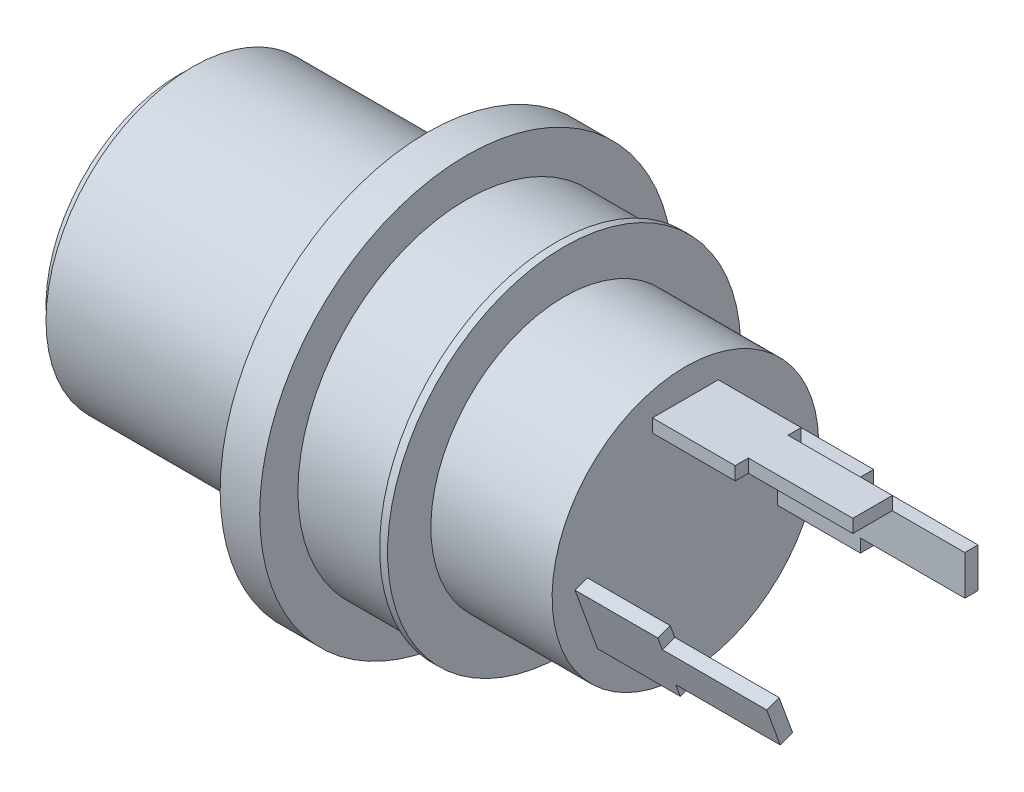
ISO-10303-21;
HEADER;
FILE_DESCRIPTION(('STEP AP214'),'2;1');
FILE_NAME('part.step','',(''),(''),'','','');
FILE_SCHEMA(('AUTOMOTIVE_DESIGN { 1 0 10303 214 1 1 1 1 }'));
ENDSEC;
DATA;
#1=APPLICATION_CONTEXT('core data for automotive mechanical design processes');
#2=APPLICATION_PROTOCOL_DEFINITION('international standard','automotive_design',2000,#1);
#3=PRODUCT_CONTEXT('',#1,'mechanical');
#4=PRODUCT('Part','Part','',(#3));
#5=PRODUCT_RELATED_PRODUCT_CATEGORY('part','',(#4));
#6=PRODUCT_DEFINITION_FORMATION('','',#4);
#7=PRODUCT_DEFINITION_CONTEXT('part definition',#1,'design');
#8=PRODUCT_DEFINITION('design','',#6,#7);
#9=PRODUCT_DEFINITION_SHAPE('','',#8);
#10=(LENGTH_UNIT() NAMED_UNIT(*) SI_UNIT(.MILLI.,.METRE.));
#11=(NAMED_UNIT(*) PLANE_ANGLE_UNIT() SI_UNIT($,.RADIAN.));
#12=(NAMED_UNIT(*) SI_UNIT($,.STERADIAN.) SOLID_ANGLE_UNIT());
#13=UNCERTAINTY_MEASURE_WITH_UNIT(LENGTH_MEASURE(1.E-05),#10,'distance_accuracy_value','');
#14=(GEOMETRIC_REPRESENTATION_CONTEXT(3) GLOBAL_UNCERTAINTY_ASSIGNED_CONTEXT((#13)) GLOBAL_UNIT_ASSIGNED_CONTEXT((#10,
#11,#12)) REPRESENTATION_CONTEXT('',''));
#15=CARTESIAN_POINT('',(0.,0.,0.));
#16=DIRECTION('',(0.,0.,1.));
#17=DIRECTION('',(1.,0.,0.));
#18=AXIS2_PLACEMENT_3D('',#15,#16,#17);
#19=CARTESIAN_POINT('',(36.2472739636741,4.,-1.25));
#20=DIRECTION('',(0.,0.,-1.));
#21=DIRECTION('',(-1.,0.,0.));
#22=AXIS2_PLACEMENT_3D('',#19,#20,#21);
#23=PLANE('',#22);
#24=DIRECTION('',(-1.,0.,0.));
#25=VECTOR('',#24,1.);
#26=CARTESIAN_POINT('',(36.2472739636741,4.,-1.25));
#27=LINE('',#26,#25);
#28=CARTESIAN_POINT('',(3.14,4.,-1.25));
#29=VERTEX_POINT('',#28);
#30=CARTESIAN_POINT('',(0.,4.,-1.25));
#31=VERTEX_POINT('',#30);
#32=EDGE_CURVE('E215',#29,#31,#27,.T.);
#33=ORIENTED_EDGE('',*,*,#32,.F.);
#34=DIRECTION('',(0.,1.,0.));
#35=VECTOR('',#34,1.);
#36=CARTESIAN_POINT('',(3.14,3.5,-1.25));
#37=LINE('',#36,#35);
#38=CARTESIAN_POINT('',(3.14,3.5,-1.25));
#39=VERTEX_POINT('',#38);
#40=EDGE_CURVE('E200',#39,#29,#37,.T.);
#41=ORIENTED_EDGE('',*,*,#40,.F.);
#42=DIRECTION('',(-1.,0.,0.));
#43=VECTOR('',#42,1.);
#44=CARTESIAN_POINT('',(36.2472739636741,3.5,-1.25));
#45=LINE('',#44,#43);
#46=CARTESIAN_POINT('',(0.,3.5,-1.25));
#47=VERTEX_POINT('',#46);
#48=EDGE_CURVE('E223',#39,#47,#45,.T.);
#49=ORIENTED_EDGE('',*,*,#48,.T.);
#50=DIRECTION('',(0.,-1.,0.));
#51=VECTOR('',#50,1.);
#52=CARTESIAN_POINT('',(0.,4.,-1.25));
#53=LINE('',#52,#51);
#54=EDGE_CURVE('E222',#31,#47,#53,.T.);
#55=ORIENTED_EDGE('',*,*,#54,.F.);
#56=EDGE_LOOP('',(#33,#41,#49,#55));
#57=FACE_BOUND('',#56,.T.);
#58=ADVANCED_FACE('F39',(#57),#23,.T.);
#59=CARTESIAN_POINT('',(36.2472739636741,3.5,1.25));
#60=DIRECTION('',(0.,0.,1.));
#61=DIRECTION('',(1.,0.,0.));
#62=AXIS2_PLACEMENT_3D('',#59,#60,#61);
#63=PLANE('',#62);
#64=DIRECTION('',(-1.,0.,0.));
#65=VECTOR('',#64,1.);
#66=CARTESIAN_POINT('',(36.2472739636741,3.5,1.25));
#67=LINE('',#66,#65);
#68=CARTESIAN_POINT('',(3.14,3.5,1.25));
#69=VERTEX_POINT('',#68);
#70=CARTESIAN_POINT('',(0.,3.5,1.25));
#71=VERTEX_POINT('',#70);
#72=EDGE_CURVE('E228',#69,#71,#67,.T.);
#73=ORIENTED_EDGE('',*,*,#72,.F.);
#74=DIRECTION('',(0.,-1.,0.));
#75=VECTOR('',#74,1.);
#76=CARTESIAN_POINT('',(3.14,4.,1.25));
#77=LINE('',#76,#75);
#78=CARTESIAN_POINT('',(3.14,4.,1.25));
#79=VERTEX_POINT('',#78);
#80=EDGE_CURVE('E458',#79,#69,#77,.T.);
#81=ORIENTED_EDGE('',*,*,#80,.F.);
#82=DIRECTION('',(-1.,0.,0.));
#83=VECTOR('',#82,1.);
#84=CARTESIAN_POINT('',(36.2472739636741,4.,1.25));
#85=LINE('',#84,#83);
#86=CARTESIAN_POINT('',(0.,4.,1.25));
#87=VERTEX_POINT('',#86);
#88=EDGE_CURVE('E224',#79,#87,#85,.T.);
#89=ORIENTED_EDGE('',*,*,#88,.T.);
#90=DIRECTION('',(0.,1.,0.));
#91=VECTOR('',#90,1.);
#92=CARTESIAN_POINT('',(0.,3.5,1.25));
#93=LINE('',#92,#91);
#94=EDGE_CURVE('E449',#71,#87,#93,.T.);
#95=ORIENTED_EDGE('',*,*,#94,.F.);
#96=EDGE_LOOP('',(#73,#81,#89,#95));
#97=FACE_BOUND('',#96,.T.);
#98=ADVANCED_FACE('F286',(#97),#63,.T.);
#99=CARTESIAN_POINT('',(36.2472739636741,1.25,-3.5));
#100=DIRECTION('',(0.,1.,0.));
#101=DIRECTION('',(-1.,0.,0.));
#102=AXIS2_PLACEMENT_3D('',#99,#100,#101);
#103=PLANE('',#102);
#104=DIRECTION('',(-1.,0.,0.));
#105=VECTOR('',#104,1.);
#106=CARTESIAN_POINT('',(36.2472739636741,1.25,-3.5));
#107=LINE('',#106,#105);
#108=CARTESIAN_POINT('',(3.14,1.25,-3.5));
#109=VERTEX_POINT('',#108);
#110=CARTESIAN_POINT('',(0.,1.25,-3.5));
#111=VERTEX_POINT('',#110);
#112=EDGE_CURVE('E434',#109,#111,#107,.T.);
#113=ORIENTED_EDGE('',*,*,#112,.F.);
#114=DIRECTION('',(0.,0.,1.));
#115=VECTOR('',#114,1.);
#116=CARTESIAN_POINT('',(3.14,1.25,-3.5));
#117=LINE('',#116,#115);
#118=CARTESIAN_POINT('',(3.14,1.25,-4.));
#119=VERTEX_POINT('',#118);
#120=EDGE_CURVE('E818',#119,#109,#117,.T.);
#121=ORIENTED_EDGE('',*,*,#120,.F.);
#122=DIRECTION('',(-1.,0.,0.));
#123=VECTOR('',#122,1.);
#124=CARTESIAN_POINT('',(36.2472739636741,1.25,-4.));
#125=LINE('',#124,#123);
#126=CARTESIAN_POINT('',(0.,1.25,-4.));
#127=VERTEX_POINT('',#126);
#128=EDGE_CURVE('E436',#119,#127,#125,.T.);
#129=ORIENTED_EDGE('',*,*,#128,.T.);
#130=DIRECTION('',(0.,0.,-1.));
#131=VECTOR('',#130,1.);
#132=CARTESIAN_POINT('',(0.,1.25,-3.5));
#133=LINE('',#132,#131);
#134=EDGE_CURVE('E431',#111,#127,#133,.T.);
#135=ORIENTED_EDGE('',*,*,#134,.F.);
#136=EDGE_LOOP('',(#113,#121,#129,#135));
#137=FACE_BOUND('',#136,.T.);
#138=ADVANCED_FACE('F291',(#137),#103,.T.);
#139=CARTESIAN_POINT('',(0.,5.05625,0.));
#140=DIRECTION('',(1.,0.,0.));
#141=DIRECTION('',(0.,1.,0.));
#142=AXIS2_PLACEMENT_3D('',#139,#140,#141);
#143=PLANE('',#142);
#144=CARTESIAN_POINT('',(0.,0.,0.));
#145=DIRECTION('',(1.,0.,0.));
#146=DIRECTION('',(0.,1.,0.));
#147=AXIS2_PLACEMENT_3D('',#144,#145,#146);
#148=CIRCLE('',#147,5.05625);
#149=CARTESIAN_POINT('',(0.,5.05625,0.));
#150=VERTEX_POINT('',#149);
#151=EDGE_CURVE('E239',#150,#150,#148,.T.);
#152=ORIENTED_EDGE('',*,*,#151,.T.);
#153=EDGE_LOOP('',(#152));
#154=FACE_BOUND('',#153,.T.);
#155=ORIENTED_EDGE('',*,*,#54,.T.);
#156=DIRECTION('',(0.,0.,-1.));
#157=VECTOR('',#156,1.);
#158=CARTESIAN_POINT('',(0.,3.5,1.25));
#159=LINE('',#158,#157);
#160=EDGE_CURVE('E425',#71,#47,#159,.T.);
#161=ORIENTED_EDGE('',*,*,#160,.F.);
#162=ORIENTED_EDGE('',*,*,#94,.T.);
#163=DIRECTION('',(0.,0.,-1.));
#164=VECTOR('',#163,1.);
#165=CARTESIAN_POINT('',(0.,4.,1.25));
#166=LINE('',#165,#164);
#167=EDGE_CURVE('E447',#87,#31,#166,.T.);
#168=ORIENTED_EDGE('',*,*,#167,.T.);
#169=EDGE_LOOP('',(#155,#161,#162,#168));
#170=FACE_BOUND('',#169,.T.);
#171=DIRECTION('',(0.,0.,1.));
#172=VECTOR('',#171,1.);
#173=CARTESIAN_POINT('',(0.,-1.25,-4.));
#174=LINE('',#173,#172);
#175=CARTESIAN_POINT('',(0.,-1.25,-4.));
#176=VERTEX_POINT('',#175);
#177=CARTESIAN_POINT('',(0.,-1.25,-3.5));
#178=VERTEX_POINT('',#177);
#179=EDGE_CURVE('E375',#176,#178,#174,.T.);
#180=ORIENTED_EDGE('',*,*,#179,.T.);
#181=DIRECTION('',(0.,1.,0.));
#182=VECTOR('',#181,1.);
#183=CARTESIAN_POINT('',(0.,1.25,-3.5));
#184=LINE('',#183,#182);
#185=EDGE_CURVE('E426',#111,#178,#184,.F.);
#186=ORIENTED_EDGE('',*,*,#185,.F.);
#187=ORIENTED_EDGE('',*,*,#134,.T.);
#188=DIRECTION('',(0.,1.,0.));
#189=VECTOR('',#188,1.);
#190=CARTESIAN_POINT('',(0.,1.25,-4.));
#191=LINE('',#190,#189);
#192=EDGE_CURVE('E429',#127,#176,#191,.F.);
#193=ORIENTED_EDGE('',*,*,#192,.T.);
#194=EDGE_LOOP('',(#180,#186,#187,#193));
#195=FACE_BOUND('',#194,.T.);
#196=DIRECTION('',(0.,-0.342020143325662,0.939692620785911));
#197=VECTOR('',#196,1.);
#198=CARTESIAN_POINT('',(0.,-2.37168627762221,2.86139899359361));
#199=LINE('',#198,#197);
#200=CARTESIAN_POINT('',(0.,-2.37168627762221,2.86139899359361));
#201=VERTEX_POINT('',#200);
#202=CARTESIAN_POINT('',(0.,-2.54269634928504,3.33124530398656));
#203=VERTEX_POINT('',#202);
#204=EDGE_CURVE('E381',#201,#203,#199,.T.);
#205=ORIENTED_EDGE('',*,*,#204,.T.);
#206=DIRECTION('',(0.,-0.939692620785911,-0.342020143325663));
#207=VECTOR('',#206,1.);
#208=CARTESIAN_POINT('',(0.,-0.193464797320264,4.18629566230072));
#209=LINE('',#208,#207);
#210=CARTESIAN_POINT('',(0.,-0.193464797320264,4.18629566230072));
#211=VERTEX_POINT('',#210);
#212=EDGE_CURVE('E384',#211,#203,#209,.T.);
#213=ORIENTED_EDGE('',*,*,#212,.F.);
#214=DIRECTION('',(0.,0.342020143325663,-0.939692620785911));
#215=VECTOR('',#214,1.);
#216=CARTESIAN_POINT('',(0.,-0.193464797320264,4.18629566230072));
#217=LINE('',#216,#215);
#218=CARTESIAN_POINT('',(0.,-0.0224547256574331,3.71644935190777));
#219=VERTEX_POINT('',#218);
#220=EDGE_CURVE('E409',#211,#219,#217,.T.);
#221=ORIENTED_EDGE('',*,*,#220,.T.);
#222=DIRECTION('',(0.,-0.939692620785911,-0.342020143325663));
#223=VECTOR('',#222,1.);
#224=CARTESIAN_POINT('',(0.,-0.0224547256574327,3.71644935190777));
#225=LINE('',#224,#223);
#226=EDGE_CURVE('E387',#219,#201,#225,.T.);
#227=ORIENTED_EDGE('',*,*,#226,.T.);
#228=EDGE_LOOP('',(#205,#213,#221,#227));
#229=FACE_BOUND('',#228,.T.);
#230=ADVANCED_FACE('F283',(#154,#170,#195,#229),#143,.T.);
#231=CARTESIAN_POINT('',(-19.2,0.,0.));
#232=DIRECTION('',(-1.,0.,0.));
#233=DIRECTION('',(0.,-1.,0.));
#234=AXIS2_PLACEMENT_3D('',#231,#232,#233);
#235=PLANE('',#234);
#236=CARTESIAN_POINT('',(-19.2,0.,0.));
#237=DIRECTION('',(-1.,0.,0.));
#238=DIRECTION('',(0.,-1.,0.));
#239=AXIS2_PLACEMENT_3D('',#236,#237,#238);
#240=CIRCLE('',#239,3.55625);
#241=CARTESIAN_POINT('',(-19.2,-3.55625,0.));
#242=VERTEX_POINT('',#241);
#243=EDGE_CURVE('E232',#242,#242,#240,.T.);
#244=ORIENTED_EDGE('',*,*,#243,.F.);
#245=EDGE_LOOP('',(#244));
#246=FACE_BOUND('',#245,.T.);
#247=CARTESIAN_POINT('',(-19.2,0.,0.));
#248=DIRECTION('',(1.,0.,0.));
#249=DIRECTION('',(0.,1.,0.));
#250=AXIS2_PLACEMENT_3D('',#247,#248,#249);
#251=CIRCLE('',#250,5.05625);
#252=CARTESIAN_POINT('',(-19.2,5.05625,0.));
#253=VERTEX_POINT('',#252);
#254=EDGE_CURVE('E13',#253,#253,#251,.T.);
#255=ORIENTED_EDGE('',*,*,#254,.F.);
#256=EDGE_LOOP('',(#255));
#257=FACE_BOUND('',#256,.T.);
#258=ADVANCED_FACE('F41',(#246,#257),#235,.T.);
#259=CARTESIAN_POINT('',(0.,0.,0.));
#260=DIRECTION('',(1.,0.,0.));
#261=DIRECTION('',(0.,1.,0.));
#262=AXIS2_PLACEMENT_3D('',#259,#260,#261);
#263=CYLINDRICAL_SURFACE('',#262,5.05625);
#264=ORIENTED_EDGE('',*,*,#254,.T.);
#265=EDGE_LOOP('',(#264));
#266=FACE_BOUND('',#265,.T.);
#267=CARTESIAN_POINT('',(-18.7,0.,0.));
#268=DIRECTION('',(1.,0.,0.));
#269=DIRECTION('',(0.,1.,0.));
#270=AXIS2_PLACEMENT_3D('',#267,#268,#269);
#271=CIRCLE('',#270,5.05625);
#272=CARTESIAN_POINT('',(-18.7,5.05625,0.));
#273=VERTEX_POINT('',#272);
#274=EDGE_CURVE('E47',#273,#273,#271,.T.);
#275=ORIENTED_EDGE('',*,*,#274,.F.);
#276=EDGE_LOOP('',(#275));
#277=FACE_BOUND('',#276,.T.);
#278=ADVANCED_FACE('F274',(#266,#277),#263,.T.);
#279=CARTESIAN_POINT('',(-18.7,5.05625,0.));
#280=DIRECTION('',(-1.,0.,0.));
#281=DIRECTION('',(0.,-1.,0.));
#282=AXIS2_PLACEMENT_3D('',#279,#280,#281);
#283=PLANE('',#282);
#284=ORIENTED_EDGE('',*,*,#274,.T.);
#285=EDGE_LOOP('',(#284));
#286=FACE_BOUND('',#285,.T.);
#287=CARTESIAN_POINT('',(-18.7,0.,0.));
#288=DIRECTION('',(1.,0.,0.));
#289=DIRECTION('',(0.,1.,0.));
#290=AXIS2_PLACEMENT_3D('',#287,#288,#289);
#291=CIRCLE('',#290,5.55625);
#292=CARTESIAN_POINT('',(-18.7,5.55625,0.));
#293=VERTEX_POINT('',#292);
#294=EDGE_CURVE('E266',#293,#293,#291,.T.);
#295=ORIENTED_EDGE('',*,*,#294,.F.);
#296=EDGE_LOOP('',(#295));
#297=FACE_BOUND('',#296,.T.);
#298=ADVANCED_FACE('F271',(#286,#297),#283,.T.);
#299=CARTESIAN_POINT('',(0.,0.,0.));
#300=DIRECTION('',(1.,0.,0.));
#301=DIRECTION('',(0.,1.,0.));
#302=AXIS2_PLACEMENT_3D('',#299,#300,#301);
#303=CYLINDRICAL_SURFACE('',#302,5.55625);
#304=ORIENTED_EDGE('',*,*,#294,.T.);
#305=EDGE_LOOP('',(#304));
#306=FACE_BOUND('',#305,.T.);
#307=CARTESIAN_POINT('',(-9.8,0.,0.));
#308=DIRECTION('',(1.,0.,0.));
#309=DIRECTION('',(0.,1.,0.));
#310=AXIS2_PLACEMENT_3D('',#307,#308,#309);
#311=CIRCLE('',#310,5.55625);
#312=CARTESIAN_POINT('',(-9.8,5.55625,0.));
#313=VERTEX_POINT('',#312);
#314=EDGE_CURVE('E263',#313,#313,#311,.T.);
#315=ORIENTED_EDGE('',*,*,#314,.F.);
#316=EDGE_LOOP('',(#315));
#317=FACE_BOUND('',#316,.T.);
#318=ADVANCED_FACE('F281',(#306,#317),#303,.T.);
#319=CARTESIAN_POINT('',(-9.8,5.55625,0.));
#320=DIRECTION('',(-1.,0.,0.));
#321=DIRECTION('',(0.,-1.,0.));
#322=AXIS2_PLACEMENT_3D('',#319,#320,#321);
#323=PLANE('',#322);
#324=ORIENTED_EDGE('',*,*,#314,.T.);
#325=EDGE_LOOP('',(#324));
#326=FACE_BOUND('',#325,.T.);
#327=CARTESIAN_POINT('',(-9.8,0.,0.));
#328=DIRECTION('',(1.,0.,0.));
#329=DIRECTION('',(0.,1.,0.));
#330=AXIS2_PLACEMENT_3D('',#327,#328,#329);
#331=CIRCLE('',#330,7.85);
#332=CARTESIAN_POINT('',(-9.8,7.85,0.));
#333=VERTEX_POINT('',#332);
#334=EDGE_CURVE('E260',#333,#333,#331,.T.);
#335=ORIENTED_EDGE('',*,*,#334,.F.);
#336=EDGE_LOOP('',(#335));
#337=FACE_BOUND('',#336,.T.);
#338=ADVANCED_FACE('F338',(#326,#337),#323,.T.);
#339=CARTESIAN_POINT('',(0.,0.,0.));
#340=DIRECTION('',(1.,0.,0.));
#341=DIRECTION('',(0.,1.,0.));
#342=AXIS2_PLACEMENT_3D('',#339,#340,#341);
#343=CYLINDRICAL_SURFACE('',#342,7.85);
#344=ORIENTED_EDGE('',*,*,#334,.T.);
#345=EDGE_LOOP('',(#344));
#346=FACE_BOUND('',#345,.T.);
#347=CARTESIAN_POINT('',(-8.3,0.,0.));
#348=DIRECTION('',(1.,0.,0.));
#349=DIRECTION('',(0.,1.,0.));
#350=AXIS2_PLACEMENT_3D('',#347,#348,#349);
#351=CIRCLE('',#350,7.85);
#352=CARTESIAN_POINT('',(-8.3,7.85,0.));
#353=VERTEX_POINT('',#352);
#354=EDGE_CURVE('E257',#353,#353,#351,.T.);
#355=ORIENTED_EDGE('',*,*,#354,.F.);
#356=EDGE_LOOP('',(#355));
#357=FACE_BOUND('',#356,.T.);
#358=ADVANCED_FACE('F334',(#346,#357),#343,.T.);
#359=CARTESIAN_POINT('',(-8.3,7.85,0.));
#360=DIRECTION('',(1.,0.,0.));
#361=DIRECTION('',(0.,1.,0.));
#362=AXIS2_PLACEMENT_3D('',#359,#360,#361);
#363=PLANE('',#362);
#364=ORIENTED_EDGE('',*,*,#354,.T.);
#365=EDGE_LOOP('',(#364));
#366=FACE_BOUND('',#365,.T.);
#367=CARTESIAN_POINT('',(-8.3,0.,0.));
#368=DIRECTION('',(1.,0.,0.));
#369=DIRECTION('',(0.,1.,0.));
#370=AXIS2_PLACEMENT_3D('',#367,#368,#369);
#371=CIRCLE('',#370,6.4);
#372=CARTESIAN_POINT('',(-8.3,6.4,0.));
#373=VERTEX_POINT('',#372);
#374=EDGE_CURVE('E254',#373,#373,#371,.T.);
#375=ORIENTED_EDGE('',*,*,#374,.F.);
#376=EDGE_LOOP('',(#375));
#377=FACE_BOUND('',#376,.T.);
#378=ADVANCED_FACE('F330',(#366,#377),#363,.T.);
#379=CARTESIAN_POINT('',(0.,0.,0.));
#380=DIRECTION('',(1.,0.,0.));
#381=DIRECTION('',(0.,1.,0.));
#382=AXIS2_PLACEMENT_3D('',#379,#380,#381);
#383=CYLINDRICAL_SURFACE('',#382,6.4);
#384=ORIENTED_EDGE('',*,*,#374,.T.);
#385=EDGE_LOOP('',(#384));
#386=FACE_BOUND('',#385,.T.);
#387=CARTESIAN_POINT('',(-4.9,0.,0.));
#388=DIRECTION('',(1.,0.,0.));
#389=DIRECTION('',(0.,1.,0.));
#390=AXIS2_PLACEMENT_3D('',#387,#388,#389);
#391=CIRCLE('',#390,6.4);
#392=CARTESIAN_POINT('',(-4.9,6.4,0.));
#393=VERTEX_POINT('',#392);
#394=EDGE_CURVE('E251',#393,#393,#391,.T.);
#395=ORIENTED_EDGE('',*,*,#394,.F.);
#396=EDGE_LOOP('',(#395));
#397=FACE_BOUND('',#396,.T.);
#398=ADVANCED_FACE('F326',(#386,#397),#383,.T.);
#399=CARTESIAN_POINT('',(-4.9,6.4,0.));
#400=DIRECTION('',(-1.,0.,0.));
#401=DIRECTION('',(0.,-1.,0.));
#402=AXIS2_PLACEMENT_3D('',#399,#400,#401);
#403=PLANE('',#402);
#404=ORIENTED_EDGE('',*,*,#394,.T.);
#405=EDGE_LOOP('',(#404));
#406=FACE_BOUND('',#405,.T.);
#407=CARTESIAN_POINT('',(-4.9,0.,0.));
#408=DIRECTION('',(1.,0.,0.));
#409=DIRECTION('',(0.,1.,0.));
#410=AXIS2_PLACEMENT_3D('',#407,#408,#409);
#411=CIRCLE('',#410,6.7);
#412=CARTESIAN_POINT('',(-4.9,6.7,0.));
#413=VERTEX_POINT('',#412);
#414=EDGE_CURVE('E248',#413,#413,#411,.T.);
#415=ORIENTED_EDGE('',*,*,#414,.F.);
#416=EDGE_LOOP('',(#415));
#417=FACE_BOUND('',#416,.T.);
#418=ADVANCED_FACE('F322',(#406,#417),#403,.T.);
#419=CARTESIAN_POINT('',(0.,0.,0.));
#420=DIRECTION('',(1.,0.,0.));
#421=DIRECTION('',(0.,1.,0.));
#422=AXIS2_PLACEMENT_3D('',#419,#420,#421);
#423=CYLINDRICAL_SURFACE('',#422,6.7);
#424=ORIENTED_EDGE('',*,*,#414,.T.);
#425=EDGE_LOOP('',(#424));
#426=FACE_BOUND('',#425,.T.);
#427=CARTESIAN_POINT('',(-4.6,0.,0.));
#428=DIRECTION('',(1.,0.,0.));
#429=DIRECTION('',(0.,1.,0.));
#430=AXIS2_PLACEMENT_3D('',#427,#428,#429);
#431=CIRCLE('',#430,6.7);
#432=CARTESIAN_POINT('',(-4.6,6.7,0.));
#433=VERTEX_POINT('',#432);
#434=EDGE_CURVE('E245',#433,#433,#431,.T.);
#435=ORIENTED_EDGE('',*,*,#434,.F.);
#436=EDGE_LOOP('',(#435));
#437=FACE_BOUND('',#436,.T.);
#438=ADVANCED_FACE('F318',(#426,#437),#423,.T.);
#439=CARTESIAN_POINT('',(-4.6,6.7,0.));
#440=DIRECTION('',(1.,0.,0.));
#441=DIRECTION('',(0.,1.,0.));
#442=AXIS2_PLACEMENT_3D('',#439,#440,#441);
#443=PLANE('',#442);
#444=ORIENTED_EDGE('',*,*,#434,.T.);
#445=EDGE_LOOP('',(#444));
#446=FACE_BOUND('',#445,.T.);
#447=CARTESIAN_POINT('',(-4.6,0.,0.));
#448=DIRECTION('',(1.,0.,0.));
#449=DIRECTION('',(0.,1.,0.));
#450=AXIS2_PLACEMENT_3D('',#447,#448,#449);
#451=CIRCLE('',#450,5.05625);
#452=CARTESIAN_POINT('',(-4.6,5.05625,0.));
#453=VERTEX_POINT('',#452);
#454=EDGE_CURVE('E242',#453,#453,#451,.T.);
#455=ORIENTED_EDGE('',*,*,#454,.F.);
#456=EDGE_LOOP('',(#455));
#457=FACE_BOUND('',#456,.T.);
#458=ADVANCED_FACE('F314',(#446,#457),#443,.T.);
#459=CARTESIAN_POINT('',(0.,0.,0.));
#460=DIRECTION('',(1.,0.,0.));
#461=DIRECTION('',(0.,1.,0.));
#462=AXIS2_PLACEMENT_3D('',#459,#460,#461);
#463=CYLINDRICAL_SURFACE('',#462,5.05625);
#464=ORIENTED_EDGE('',*,*,#454,.T.);
#465=EDGE_LOOP('',(#464));
#466=FACE_BOUND('',#465,.T.);
#467=ORIENTED_EDGE('',*,*,#151,.F.);
#468=EDGE_LOOP('',(#467));
#469=FACE_BOUND('',#468,.T.);
#470=ADVANCED_FACE('F307',(#466,#469),#463,.T.);
#471=CARTESIAN_POINT('',(0.258593962378643,0.,0.));
#472=DIRECTION('',(-1.,0.,0.));
#473=DIRECTION('',(0.,-1.,0.));
#474=AXIS2_PLACEMENT_3D('',#471,#472,#473);
#475=CYLINDRICAL_SURFACE('',#474,3.55625);
#476=CARTESIAN_POINT('',(-11.3,0.,0.));
#477=DIRECTION('',(-1.,0.,0.));
#478=DIRECTION('',(0.,-1.,0.));
#479=AXIS2_PLACEMENT_3D('',#476,#477,#478);
#480=CIRCLE('',#479,3.55625);
#481=CARTESIAN_POINT('',(-11.3,-3.55625,0.));
#482=VERTEX_POINT('',#481);
#483=EDGE_CURVE('E235',#482,#482,#480,.F.);
#484=ORIENTED_EDGE('',*,*,#483,.T.);
#485=EDGE_LOOP('',(#484));
#486=FACE_BOUND('',#485,.T.);
#487=ORIENTED_EDGE('',*,*,#243,.T.);
#488=EDGE_LOOP('',(#487));
#489=FACE_BOUND('',#488,.T.);
#490=ADVANCED_FACE('F303',(#486,#489),#475,.F.);
#491=CARTESIAN_POINT('',(-11.3,5.55625,0.));
#492=DIRECTION('',(-1.,0.,0.));
#493=DIRECTION('',(0.,-1.,0.));
#494=AXIS2_PLACEMENT_3D('',#491,#492,#493);
#495=PLANE('',#494);
#496=ORIENTED_EDGE('',*,*,#483,.F.);
#497=EDGE_LOOP('',(#496));
#498=FACE_BOUND('',#497,.T.);
#499=ADVANCED_FACE('F299',(#498),#495,.T.);
#500=CARTESIAN_POINT('',(36.2472739636741,3.5,1.25));
#501=DIRECTION('',(0.,1.,0.));
#502=DIRECTION('',(0.,0.,1.));
#503=AXIS2_PLACEMENT_3D('',#500,#501,#502);
#504=PLANE('',#503);
#505=DIRECTION('',(0.,0.,-1.));
#506=VECTOR('',#505,1.);
#507=CARTESIAN_POINT('',(3.14,3.5,-1.25));
#508=LINE('',#507,#506);
#509=CARTESIAN_POINT('',(3.14,3.5,-0.749999999999998));
#510=VERTEX_POINT('',#509);
#511=EDGE_CURVE('E206',#510,#39,#508,.T.);
#512=ORIENTED_EDGE('',*,*,#511,.F.);
#513=DIRECTION('',(1.,0.,0.));
#514=VECTOR('',#513,1.);
#515=CARTESIAN_POINT('',(3.14,3.5,-0.749999999999998));
#516=LINE('',#515,#514);
#517=CARTESIAN_POINT('',(7.1,3.5,-0.749999999999998));
#518=VERTEX_POINT('',#517);
#519=EDGE_CURVE('E470',#510,#518,#516,.T.);
#520=ORIENTED_EDGE('',*,*,#519,.T.);
#521=DIRECTION('',(0.,0.,1.));
#522=VECTOR('',#521,1.);
#523=CARTESIAN_POINT('',(7.1,3.5,1.25));
#524=LINE('',#523,#522);
#525=CARTESIAN_POINT('',(7.1,3.5,0.749999999999998));
#526=VERTEX_POINT('',#525);
#527=EDGE_CURVE('E236',#518,#526,#524,.T.);
#528=ORIENTED_EDGE('',*,*,#527,.T.);
#529=DIRECTION('',(1.,0.,0.));
#530=VECTOR('',#529,1.);
#531=CARTESIAN_POINT('',(3.14,3.5,0.749999999999998));
#532=LINE('',#531,#530);
#533=CARTESIAN_POINT('',(3.14,3.5,0.749999999999998));
#534=VERTEX_POINT('',#533);
#535=EDGE_CURVE('E54',#534,#526,#532,.T.);
#536=ORIENTED_EDGE('',*,*,#535,.F.);
#537=DIRECTION('',(0.,0.,-1.));
#538=VECTOR('',#537,1.);
#539=CARTESIAN_POINT('',(3.14,3.5,1.25));
#540=LINE('',#539,#538);
#541=EDGE_CURVE('E454',#69,#534,#540,.T.);
#542=ORIENTED_EDGE('',*,*,#541,.F.);
#543=ORIENTED_EDGE('',*,*,#72,.T.);
#544=ORIENTED_EDGE('',*,*,#160,.T.);
#545=ORIENTED_EDGE('',*,*,#48,.F.);
#546=EDGE_LOOP('',(#512,#520,#528,#536,#542,#543,#544,#545));
#547=FACE_BOUND('',#546,.T.);
#548=ADVANCED_FACE('F296',(#547),#504,.F.);
#549=CARTESIAN_POINT('',(36.2472739636741,4.,1.25));
#550=DIRECTION('',(0.,1.,0.));
#551=DIRECTION('',(0.,0.,1.));
#552=AXIS2_PLACEMENT_3D('',#549,#550,#551);
#553=PLANE('',#552);
#554=DIRECTION('',(1.,0.,0.));
#555=VECTOR('',#554,1.);
#556=CARTESIAN_POINT('',(3.14,4.,-0.749999999999998));
#557=LINE('',#556,#555);
#558=CARTESIAN_POINT('',(3.14,4.,-0.749999999999998));
#559=VERTEX_POINT('',#558);
#560=CARTESIAN_POINT('',(7.1,4.,-0.749999999999998));
#561=VERTEX_POINT('',#560);
#562=EDGE_CURVE('E62',#559,#561,#557,.T.);
#563=ORIENTED_EDGE('',*,*,#562,.F.);
#564=DIRECTION('',(0.,0.,1.));
#565=VECTOR('',#564,1.);
#566=CARTESIAN_POINT('',(3.14,4.,-1.25));
#567=LINE('',#566,#565);
#568=EDGE_CURVE('E204',#29,#559,#567,.T.);
#569=ORIENTED_EDGE('',*,*,#568,.F.);
#570=ORIENTED_EDGE('',*,*,#32,.T.);
#571=ORIENTED_EDGE('',*,*,#167,.F.);
#572=ORIENTED_EDGE('',*,*,#88,.F.);
#573=DIRECTION('',(0.,0.,1.));
#574=VECTOR('',#573,1.);
#575=CARTESIAN_POINT('',(3.14,4.,1.25));
#576=LINE('',#575,#574);
#577=CARTESIAN_POINT('',(3.14,4.,0.749999999999998));
#578=VERTEX_POINT('',#577);
#579=EDGE_CURVE('E460',#578,#79,#576,.T.);
#580=ORIENTED_EDGE('',*,*,#579,.F.);
#581=DIRECTION('',(1.,0.,0.));
#582=VECTOR('',#581,1.);
#583=CARTESIAN_POINT('',(3.14,4.,0.749999999999998));
#584=LINE('',#583,#582);
#585=CARTESIAN_POINT('',(7.1,4.,0.749999999999998));
#586=VERTEX_POINT('',#585);
#587=EDGE_CURVE('E400',#578,#586,#584,.T.);
#588=ORIENTED_EDGE('',*,*,#587,.T.);
#589=DIRECTION('',(0.,0.,1.));
#590=VECTOR('',#589,1.);
#591=CARTESIAN_POINT('',(7.1,4.,1.25));
#592=LINE('',#591,#590);
#593=EDGE_CURVE('E226',#561,#586,#592,.T.);
#594=ORIENTED_EDGE('',*,*,#593,.F.);
#595=EDGE_LOOP('',(#563,#569,#570,#571,#572,#580,#588,#594));
#596=FACE_BOUND('',#595,.T.);
#597=ADVANCED_FACE('F213',(#596),#553,.T.);
#598=CARTESIAN_POINT('',(7.1,0.,0.));
#599=DIRECTION('',(-1.,0.,0.));
#600=DIRECTION('',(0.,-1.,0.));
#601=AXIS2_PLACEMENT_3D('',#598,#599,#600);
#602=PLANE('',#601);
#603=ORIENTED_EDGE('',*,*,#527,.F.);
#604=DIRECTION('',(0.,-1.,0.));
#605=VECTOR('',#604,1.);
#606=CARTESIAN_POINT('',(7.1,3.5,-0.749999999999998));
#607=LINE('',#606,#605);
#608=EDGE_CURVE('E210',#561,#518,#607,.T.);
#609=ORIENTED_EDGE('',*,*,#608,.F.);
#610=ORIENTED_EDGE('',*,*,#593,.T.);
#611=DIRECTION('',(0.,1.,0.));
#612=VECTOR('',#611,1.);
#613=CARTESIAN_POINT('',(7.1,4.,0.749999999999998));
#614=LINE('',#613,#612);
#615=EDGE_CURVE('E469',#526,#586,#614,.T.);
#616=ORIENTED_EDGE('',*,*,#615,.F.);
#617=EDGE_LOOP('',(#603,#609,#610,#616));
#618=FACE_BOUND('',#617,.T.);
#619=ADVANCED_FACE('F501',(#618),#602,.F.);
#620=CARTESIAN_POINT('',(36.2472739636741,1.25,-3.5));
#621=DIRECTION('',(0.,0.,-1.));
#622=DIRECTION('',(-1.,0.,0.));
#623=AXIS2_PLACEMENT_3D('',#620,#621,#622);
#624=PLANE('',#623);
#625=DIRECTION('',(0.,-1.,0.));
#626=VECTOR('',#625,1.);
#627=CARTESIAN_POINT('',(3.14,-1.25,-3.5));
#628=LINE('',#627,#626);
#629=CARTESIAN_POINT('',(3.14,-0.749999999999998,-3.5));
#630=VERTEX_POINT('',#629);
#631=CARTESIAN_POINT('',(3.14,-1.25,-3.5));
#632=VERTEX_POINT('',#631);
#633=EDGE_CURVE('E823',#630,#632,#628,.T.);
#634=ORIENTED_EDGE('',*,*,#633,.F.);
#635=DIRECTION('',(1.,0.,0.));
#636=VECTOR('',#635,1.);
#637=CARTESIAN_POINT('',(3.14,-0.749999999999998,-3.5));
#638=LINE('',#637,#636);
#639=CARTESIAN_POINT('',(7.1,-0.749999999999997,-3.5));
#640=VERTEX_POINT('',#639);
#641=EDGE_CURVE('E820',#630,#640,#638,.T.);
#642=ORIENTED_EDGE('',*,*,#641,.T.);
#643=DIRECTION('',(0.,1.,0.));
#644=VECTOR('',#643,1.);
#645=CARTESIAN_POINT('',(7.1,1.25,-3.5));
#646=LINE('',#645,#644);
#647=CARTESIAN_POINT('',(7.1,0.749999999999999,-3.5));
#648=VERTEX_POINT('',#647);
#649=EDGE_CURVE('E421',#640,#648,#646,.T.);
#650=ORIENTED_EDGE('',*,*,#649,.T.);
#651=DIRECTION('',(1.,0.,0.));
#652=VECTOR('',#651,1.);
#653=CARTESIAN_POINT('',(3.14,0.749999999999999,-3.5));
#654=LINE('',#653,#652);
#655=CARTESIAN_POINT('',(3.14,0.749999999999999,-3.5));
#656=VERTEX_POINT('',#655);
#657=EDGE_CURVE('E802',#656,#648,#654,.T.);
#658=ORIENTED_EDGE('',*,*,#657,.F.);
#659=DIRECTION('',(0.,-1.,0.));
#660=VECTOR('',#659,1.);
#661=CARTESIAN_POINT('',(3.14,1.25,-3.5));
#662=LINE('',#661,#660);
#663=EDGE_CURVE('E809',#109,#656,#662,.T.);
#664=ORIENTED_EDGE('',*,*,#663,.F.);
#665=ORIENTED_EDGE('',*,*,#112,.T.);
#666=ORIENTED_EDGE('',*,*,#185,.T.);
#667=DIRECTION('',(-1.,0.,0.));
#668=VECTOR('',#667,1.);
#669=CARTESIAN_POINT('',(36.2472739636741,-1.25,-3.5));
#670=LINE('',#669,#668);
#671=EDGE_CURVE('E422',#632,#178,#670,.T.);
#672=ORIENTED_EDGE('',*,*,#671,.F.);
#673=EDGE_LOOP('',(#634,#642,#650,#658,#664,#665,#666,#672));
#674=FACE_BOUND('',#673,.T.);
#675=ADVANCED_FACE('F547',(#674),#624,.F.);
#676=CARTESIAN_POINT('',(36.2472739636741,-1.25,-4.));
#677=DIRECTION('',(0.,-1.,0.));
#678=DIRECTION('',(1.,0.,0.));
#679=AXIS2_PLACEMENT_3D('',#676,#677,#678);
#680=PLANE('',#679);
#681=DIRECTION('',(0.,0.,-1.));
#682=VECTOR('',#681,1.);
#683=CARTESIAN_POINT('',(3.14,-1.25,-3.5));
#684=LINE('',#683,#682);
#685=CARTESIAN_POINT('',(3.14,-1.25,-4.));
#686=VERTEX_POINT('',#685);
#687=EDGE_CURVE('E825',#632,#686,#684,.T.);
#688=ORIENTED_EDGE('',*,*,#687,.F.);
#689=ORIENTED_EDGE('',*,*,#671,.T.);
#690=ORIENTED_EDGE('',*,*,#179,.F.);
#691=DIRECTION('',(-1.,0.,0.));
#692=VECTOR('',#691,1.);
#693=CARTESIAN_POINT('',(36.2472739636741,-1.25,-4.));
#694=LINE('',#693,#692);
#695=EDGE_CURVE('E438',#686,#176,#694,.T.);
#696=ORIENTED_EDGE('',*,*,#695,.F.);
#697=EDGE_LOOP('',(#688,#689,#690,#696));
#698=FACE_BOUND('',#697,.T.);
#699=ADVANCED_FACE('F543',(#698),#680,.T.);
#700=CARTESIAN_POINT('',(36.2472739636741,1.25,-4.));
#701=DIRECTION('',(0.,0.,-1.));
#702=DIRECTION('',(-1.,0.,0.));
#703=AXIS2_PLACEMENT_3D('',#700,#701,#702);
#704=PLANE('',#703);
#705=DIRECTION('',(1.,0.,0.));
#706=VECTOR('',#705,1.);
#707=CARTESIAN_POINT('',(3.14,-0.749999999999998,-4.));
#708=LINE('',#707,#706);
#709=CARTESIAN_POINT('',(3.14,-0.749999999999998,-4.));
#710=VERTEX_POINT('',#709);
#711=CARTESIAN_POINT('',(7.1,-0.749999999999997,-4.));
#712=VERTEX_POINT('',#711);
#713=EDGE_CURVE('E833',#710,#712,#708,.T.);
#714=ORIENTED_EDGE('',*,*,#713,.F.);
#715=DIRECTION('',(0.,1.,0.));
#716=VECTOR('',#715,1.);
#717=CARTESIAN_POINT('',(3.14,-1.25,-4.));
#718=LINE('',#717,#716);
#719=EDGE_CURVE('E828',#686,#710,#718,.T.);
#720=ORIENTED_EDGE('',*,*,#719,.F.);
#721=ORIENTED_EDGE('',*,*,#695,.T.);
#722=ORIENTED_EDGE('',*,*,#192,.F.);
#723=ORIENTED_EDGE('',*,*,#128,.F.);
#724=DIRECTION('',(0.,1.,0.));
#725=VECTOR('',#724,1.);
#726=CARTESIAN_POINT('',(3.14,1.25,-4.));
#727=LINE('',#726,#725);
#728=CARTESIAN_POINT('',(3.14,0.749999999999999,-4.));
#729=VERTEX_POINT('',#728);
#730=EDGE_CURVE('E816',#729,#119,#727,.T.);
#731=ORIENTED_EDGE('',*,*,#730,.F.);
#732=DIRECTION('',(1.,0.,0.));
#733=VECTOR('',#732,1.);
#734=CARTESIAN_POINT('',(3.14,0.749999999999999,-4.));
#735=LINE('',#734,#733);
#736=CARTESIAN_POINT('',(7.1,0.749999999999999,-4.));
#737=VERTEX_POINT('',#736);
#738=EDGE_CURVE('E799',#729,#737,#735,.T.);
#739=ORIENTED_EDGE('',*,*,#738,.T.);
#740=DIRECTION('',(0.,1.,0.));
#741=VECTOR('',#740,1.);
#742=CARTESIAN_POINT('',(7.1,1.25,-4.));
#743=LINE('',#742,#741);
#744=EDGE_CURVE('E418',#712,#737,#743,.T.);
#745=ORIENTED_EDGE('',*,*,#744,.F.);
#746=EDGE_LOOP('',(#714,#720,#721,#722,#723,#731,#739,#745));
#747=FACE_BOUND('',#746,.T.);
#748=ADVANCED_FACE('F536',(#747),#704,.T.);
#749=CARTESIAN_POINT('',(7.1,0.,0.));
#750=DIRECTION('',(-1.,0.,0.));
#751=DIRECTION('',(0.,-1.,0.));
#752=AXIS2_PLACEMENT_3D('',#749,#750,#751);
#753=PLANE('',#752);
#754=ORIENTED_EDGE('',*,*,#649,.F.);
#755=DIRECTION('',(0.,0.,1.));
#756=VECTOR('',#755,1.);
#757=CARTESIAN_POINT('',(7.1,-0.749999999999997,-3.5));
#758=LINE('',#757,#756);
#759=EDGE_CURVE('E826',#712,#640,#758,.T.);
#760=ORIENTED_EDGE('',*,*,#759,.F.);
#761=ORIENTED_EDGE('',*,*,#744,.T.);
#762=DIRECTION('',(0.,0.,-1.));
#763=VECTOR('',#762,1.);
#764=CARTESIAN_POINT('',(7.1,0.749999999999999,-3.5));
#765=LINE('',#764,#763);
#766=EDGE_CURVE('E813',#648,#737,#765,.T.);
#767=ORIENTED_EDGE('',*,*,#766,.F.);
#768=EDGE_LOOP('',(#754,#760,#761,#767));
#769=FACE_BOUND('',#768,.T.);
#770=ADVANCED_FACE('F533',(#769),#753,.F.);
#771=CARTESIAN_POINT('',(36.2472739636741,-0.19346479732026,4.18629566230072));
#772=DIRECTION('',(0.,0.342020143325663,-0.939692620785911));
#773=DIRECTION('',(0.,0.939692620785911,0.342020143325663));
#774=AXIS2_PLACEMENT_3D('',#771,#772,#773);
#775=PLANE('',#774);
#776=DIRECTION('',(0.,0.939692620785911,0.342020143325663));
#777=VECTOR('',#776,1.);
#778=CARTESIAN_POINT('',(7.1,-0.193464797320263,4.18629566230072));
#779=LINE('',#778,#777);
#780=CARTESIAN_POINT('',(7.1,-2.07285003889207,3.5022553756494));
#781=VERTEX_POINT('',#780);
#782=CARTESIAN_POINT('',(7.1,-0.663311107713211,4.01528559063789));
#783=VERTEX_POINT('',#782);
#784=EDGE_CURVE('E405',#781,#783,#779,.T.);
#785=ORIENTED_EDGE('',*,*,#784,.T.);
#786=DIRECTION('',(1.,0.,0.));
#787=VECTOR('',#786,1.);
#788=CARTESIAN_POINT('',(3.14,-0.663311107713211,4.01528559063789));
#789=LINE('',#788,#787);
#790=CARTESIAN_POINT('',(3.14,-0.663311107713211,4.01528559063789));
#791=VERTEX_POINT('',#790);
#792=EDGE_CURVE('E479',#791,#783,#789,.T.);
#793=ORIENTED_EDGE('',*,*,#792,.F.);
#794=DIRECTION('',(0.,-0.939692620785911,-0.342020143325661));
#795=VECTOR('',#794,1.);
#796=CARTESIAN_POINT('',(3.14,-0.193464797320264,4.18629566230072));
#797=LINE('',#796,#795);
#798=CARTESIAN_POINT('',(3.14,-0.193464797320264,4.18629566230072));
#799=VERTEX_POINT('',#798);
#800=EDGE_CURVE('E851',#799,#791,#797,.T.);
#801=ORIENTED_EDGE('',*,*,#800,.F.);
#802=DIRECTION('',(-1.,0.,0.));
#803=VECTOR('',#802,1.);
#804=CARTESIAN_POINT('',(36.2472739636741,-0.19346479732026,4.18629566230072));
#805=LINE('',#804,#803);
#806=EDGE_CURVE('E399',#799,#211,#805,.T.);
#807=ORIENTED_EDGE('',*,*,#806,.T.);
#808=ORIENTED_EDGE('',*,*,#212,.T.);
#809=DIRECTION('',(-1.,0.,0.));
#810=VECTOR('',#809,1.);
#811=CARTESIAN_POINT('',(36.2472739636741,-2.54269634928504,3.33124530398656));
#812=LINE('',#811,#810);
#813=CARTESIAN_POINT('',(3.14,-2.54269634928504,3.33124530398656));
#814=VERTEX_POINT('',#813);
#815=EDGE_CURVE('E396',#814,#203,#812,.T.);
#816=ORIENTED_EDGE('',*,*,#815,.F.);
#817=DIRECTION('',(0.,-0.939692620785911,-0.342020143325661));
#818=VECTOR('',#817,1.);
#819=CARTESIAN_POINT('',(3.14,-2.54269634928504,3.33124530398656));
#820=LINE('',#819,#818);
#821=CARTESIAN_POINT('',(3.14,-2.07285003889207,3.5022553756494));
#822=VERTEX_POINT('',#821);
#823=EDGE_CURVE('E838',#822,#814,#820,.T.);
#824=ORIENTED_EDGE('',*,*,#823,.F.);
#825=DIRECTION('',(1.,0.,0.));
#826=VECTOR('',#825,1.);
#827=CARTESIAN_POINT('',(3.14,-2.07285003889207,3.5022553756494));
#828=LINE('',#827,#826);
#829=EDGE_CURVE('E480',#822,#781,#828,.T.);
#830=ORIENTED_EDGE('',*,*,#829,.T.);
#831=EDGE_LOOP('',(#785,#793,#801,#807,#808,#816,#824,#830));
#832=FACE_BOUND('',#831,.T.);
#833=ADVANCED_FACE('F394',(#832),#775,.F.);
#834=CARTESIAN_POINT('',(36.2472739636741,-2.37168627762221,2.86139899359361));
#835=DIRECTION('',(0.,-0.939692620785911,-0.342020143325662));
#836=DIRECTION('',(0.,0.342020143325662,-0.939692620785911));
#837=AXIS2_PLACEMENT_3D('',#834,#835,#836);
#838=PLANE('',#837);
#839=DIRECTION('',(0.,0.34202014332566,-0.939692620785911));
#840=VECTOR('',#839,1.);
#841=CARTESIAN_POINT('',(3.14,-2.54269634928504,3.33124530398656));
#842=LINE('',#841,#840);
#843=CARTESIAN_POINT('',(3.14,-2.37168627762221,2.86139899359361));
#844=VERTEX_POINT('',#843);
#845=EDGE_CURVE('E840',#814,#844,#842,.T.);
#846=ORIENTED_EDGE('',*,*,#845,.F.);
#847=ORIENTED_EDGE('',*,*,#815,.T.);
#848=ORIENTED_EDGE('',*,*,#204,.F.);
#849=DIRECTION('',(-1.,0.,0.));
#850=VECTOR('',#849,1.);
#851=CARTESIAN_POINT('',(36.2472739636741,-2.37168627762221,2.86139899359361));
#852=LINE('',#851,#850);
#853=EDGE_CURVE('E414',#844,#201,#852,.T.);
#854=ORIENTED_EDGE('',*,*,#853,.F.);
#855=EDGE_LOOP('',(#846,#847,#848,#854));
#856=FACE_BOUND('',#855,.T.);
#857=ADVANCED_FACE('F527',(#856),#838,.T.);
#858=CARTESIAN_POINT('',(36.2472739636741,-0.0224547256574283,3.71644935190777));
#859=DIRECTION('',(0.,0.342020143325663,-0.939692620785911));
#860=DIRECTION('',(0.,0.939692620785911,0.342020143325663));
#861=AXIS2_PLACEMENT_3D('',#858,#859,#860);
#862=PLANE('',#861);
#863=DIRECTION('',(1.,0.,0.));
#864=VECTOR('',#863,1.);
#865=CARTESIAN_POINT('',(3.14,-0.492301036050381,3.54543928024494));
#866=LINE('',#865,#864);
#867=CARTESIAN_POINT('',(3.14,-0.492301036050381,3.54543928024494));
#868=VERTEX_POINT('',#867);
#869=CARTESIAN_POINT('',(7.1,-0.492301036050381,3.54543928024494));
#870=VERTEX_POINT('',#869);
#871=EDGE_CURVE('E494',#868,#870,#866,.T.);
#872=ORIENTED_EDGE('',*,*,#871,.T.);
#873=DIRECTION('',(0.,0.939692620785911,0.342020143325663));
#874=VECTOR('',#873,1.);
#875=CARTESIAN_POINT('',(7.1,-0.0224547256574318,3.71644935190777));
#876=LINE('',#875,#874);
#877=CARTESIAN_POINT('',(7.1,-1.90183996722924,3.03240906525644));
#878=VERTEX_POINT('',#877);
#879=EDGE_CURVE('E417',#878,#870,#876,.T.);
#880=ORIENTED_EDGE('',*,*,#879,.F.);
#881=DIRECTION('',(1.,0.,0.));
#882=VECTOR('',#881,1.);
#883=CARTESIAN_POINT('',(3.14,-1.90183996722924,3.03240906525644));
#884=LINE('',#883,#882);
#885=CARTESIAN_POINT('',(3.14,-1.90183996722924,3.03240906525644));
#886=VERTEX_POINT('',#885);
#887=EDGE_CURVE('E847',#886,#878,#884,.T.);
#888=ORIENTED_EDGE('',*,*,#887,.F.);
#889=DIRECTION('',(0.,0.939692620785911,0.342020143325661));
#890=VECTOR('',#889,1.);
#891=CARTESIAN_POINT('',(3.14,-2.37168627762221,2.86139899359361));
#892=LINE('',#891,#890);
#893=EDGE_CURVE('E842',#844,#886,#892,.T.);
#894=ORIENTED_EDGE('',*,*,#893,.F.);
#895=ORIENTED_EDGE('',*,*,#853,.T.);
#896=ORIENTED_EDGE('',*,*,#226,.F.);
#897=DIRECTION('',(-1.,0.,0.));
#898=VECTOR('',#897,1.);
#899=CARTESIAN_POINT('',(36.2472739636741,-0.0224547256574283,3.71644935190777));
#900=LINE('',#899,#898);
#901=CARTESIAN_POINT('',(3.14,-0.0224547256574327,3.71644935190777));
#902=VERTEX_POINT('',#901);
#903=EDGE_CURVE('E412',#902,#219,#900,.T.);
#904=ORIENTED_EDGE('',*,*,#903,.F.);
#905=DIRECTION('',(0.,0.939692620785911,0.342020143325661));
#906=VECTOR('',#905,1.);
#907=CARTESIAN_POINT('',(3.14,-0.0224547256574327,3.71644935190777));
#908=LINE('',#907,#906);
#909=EDGE_CURVE('E486',#868,#902,#908,.T.);
#910=ORIENTED_EDGE('',*,*,#909,.F.);
#911=EDGE_LOOP('',(#872,#880,#888,#894,#895,#896,#904,#910));
#912=FACE_BOUND('',#911,.T.);
#913=ADVANCED_FACE('F523',(#912),#862,.T.);
#914=CARTESIAN_POINT('',(36.2472739636741,-0.19346479732026,4.18629566230072));
#915=DIRECTION('',(0.,0.93969262078591,0.342020143325663));
#916=DIRECTION('',(0.,-0.342020143325663,0.939692620785911));
#917=AXIS2_PLACEMENT_3D('',#914,#915,#916);
#918=PLANE('',#917);
#919=DIRECTION('',(0.,-0.342020143325663,0.939692620785911));
#920=VECTOR('',#919,1.);
#921=CARTESIAN_POINT('',(3.14,-0.0224547256574327,3.71644935190777));
#922=LINE('',#921,#920);
#923=EDGE_CURVE('E488',#902,#799,#922,.T.);
#924=ORIENTED_EDGE('',*,*,#923,.F.);
#925=ORIENTED_EDGE('',*,*,#903,.T.);
#926=ORIENTED_EDGE('',*,*,#220,.F.);
#927=ORIENTED_EDGE('',*,*,#806,.F.);
#928=EDGE_LOOP('',(#924,#925,#926,#927));
#929=FACE_BOUND('',#928,.T.);
#930=ADVANCED_FACE('F520',(#929),#918,.T.);
#931=CARTESIAN_POINT('',(7.1,0.,0.));
#932=DIRECTION('',(-1.,0.,0.));
#933=DIRECTION('',(0.,-1.,0.));
#934=AXIS2_PLACEMENT_3D('',#931,#932,#933);
#935=PLANE('',#934);
#936=ORIENTED_EDGE('',*,*,#879,.T.);
#937=DIRECTION('',(0.,0.34202014332566,-0.939692620785912));
#938=VECTOR('',#937,1.);
#939=CARTESIAN_POINT('',(7.1,-0.492301036050381,3.54543928024494));
#940=LINE('',#939,#938);
#941=EDGE_CURVE('E483',#783,#870,#940,.T.);
#942=ORIENTED_EDGE('',*,*,#941,.F.);
#943=ORIENTED_EDGE('',*,*,#784,.F.);
#944=DIRECTION('',(0.,-0.34202014332566,0.939692620785911));
#945=VECTOR('',#944,1.);
#946=CARTESIAN_POINT('',(7.1,-2.07285003889207,3.5022553756494));
#947=LINE('',#946,#945);
#948=EDGE_CURVE('E482',#878,#781,#947,.T.);
#949=ORIENTED_EDGE('',*,*,#948,.F.);
#950=EDGE_LOOP('',(#936,#942,#943,#949));
#951=FACE_BOUND('',#950,.T.);
#952=ADVANCED_FACE('F481',(#951),#935,.F.);
#953=CARTESIAN_POINT('',(3.14,-2.07285003889207,3.5022553756494));
#954=DIRECTION('',(0.,0.939692620785912,0.34202014332566));
#955=DIRECTION('',(0.,-0.34202014332566,0.939692620785912));
#956=AXIS2_PLACEMENT_3D('',#953,#954,#955);
#957=PLANE('',#956);
#958=ORIENTED_EDGE('',*,*,#948,.T.);
#959=ORIENTED_EDGE('',*,*,#829,.F.);
#960=DIRECTION('',(0.,-0.34202014332566,0.939692620785911));
#961=VECTOR('',#960,1.);
#962=CARTESIAN_POINT('',(3.14,-2.07285003889207,3.5022553756494));
#963=LINE('',#962,#961);
#964=EDGE_CURVE('E844',#886,#822,#963,.T.);
#965=ORIENTED_EDGE('',*,*,#964,.F.);
#966=ORIENTED_EDGE('',*,*,#887,.T.);
#967=EDGE_LOOP('',(#958,#959,#965,#966));
#968=FACE_BOUND('',#967,.T.);
#969=ADVANCED_FACE('F519',(#968),#957,.F.);
#970=CARTESIAN_POINT('',(3.14,0.,0.));
#971=DIRECTION('',(-1.,0.,0.));
#972=DIRECTION('',(0.,0.,1.));
#973=AXIS2_PLACEMENT_3D('',#970,#971,#972);
#974=PLANE('',#973);
#975=ORIENTED_EDGE('',*,*,#823,.T.);
#976=ORIENTED_EDGE('',*,*,#845,.T.);
#977=ORIENTED_EDGE('',*,*,#893,.T.);
#978=ORIENTED_EDGE('',*,*,#964,.T.);
#979=EDGE_LOOP('',(#975,#976,#977,#978));
#980=FACE_BOUND('',#979,.T.);
#981=ADVANCED_FACE('F715',(#980),#974,.F.);
#982=CARTESIAN_POINT('',(3.14,-0.492301036050381,3.54543928024494));
#983=DIRECTION('',(0.,-0.939692620785912,-0.34202014332566));
#984=DIRECTION('',(0.,0.34202014332566,-0.939692620785912));
#985=AXIS2_PLACEMENT_3D('',#982,#983,#984);
#986=PLANE('',#985);
#987=ORIENTED_EDGE('',*,*,#941,.T.);
#988=ORIENTED_EDGE('',*,*,#871,.F.);
#989=DIRECTION('',(0.,0.34202014332566,-0.939692620785912));
#990=VECTOR('',#989,1.);
#991=CARTESIAN_POINT('',(3.14,-0.492301036050381,3.54543928024494));
#992=LINE('',#991,#990);
#993=EDGE_CURVE('E492',#791,#868,#992,.T.);
#994=ORIENTED_EDGE('',*,*,#993,.F.);
#995=ORIENTED_EDGE('',*,*,#792,.T.);
#996=EDGE_LOOP('',(#987,#988,#994,#995));
#997=FACE_BOUND('',#996,.T.);
#998=ADVANCED_FACE('F724',(#997),#986,.F.);
#999=CARTESIAN_POINT('',(3.14,0.,0.));
#1000=DIRECTION('',(-1.,0.,0.));
#1001=DIRECTION('',(0.,0.,1.));
#1002=AXIS2_PLACEMENT_3D('',#999,#1000,#1001);
#1003=PLANE('',#1002);
#1004=ORIENTED_EDGE('',*,*,#909,.T.);
#1005=ORIENTED_EDGE('',*,*,#923,.T.);
#1006=ORIENTED_EDGE('',*,*,#800,.T.);
#1007=ORIENTED_EDGE('',*,*,#993,.T.);
#1008=EDGE_LOOP('',(#1004,#1005,#1006,#1007));
#1009=FACE_BOUND('',#1008,.T.);
#1010=ADVANCED_FACE('F733',(#1009),#1003,.F.);
#1011=CARTESIAN_POINT('',(3.14,0.749999999999999,-3.5));
#1012=DIRECTION('',(0.,-1.,0.));
#1013=DIRECTION('',(1.,0.,0.));
#1014=AXIS2_PLACEMENT_3D('',#1011,#1012,#1013);
#1015=PLANE('',#1014);
#1016=ORIENTED_EDGE('',*,*,#766,.T.);
#1017=ORIENTED_EDGE('',*,*,#738,.F.);
#1018=DIRECTION('',(0.,0.,-1.));
#1019=VECTOR('',#1018,1.);
#1020=CARTESIAN_POINT('',(3.14,0.749999999999999,-3.5));
#1021=LINE('',#1020,#1019);
#1022=EDGE_CURVE('E812',#656,#729,#1021,.T.);
#1023=ORIENTED_EDGE('',*,*,#1022,.F.);
#1024=ORIENTED_EDGE('',*,*,#657,.T.);
#1025=EDGE_LOOP('',(#1016,#1017,#1023,#1024));
#1026=FACE_BOUND('',#1025,.T.);
#1027=ADVANCED_FACE('F740',(#1026),#1015,.F.);
#1028=CARTESIAN_POINT('',(3.14,0.,0.));
#1029=DIRECTION('',(1.,0.,0.));
#1030=DIRECTION('',(0.,0.,-1.));
#1031=AXIS2_PLACEMENT_3D('',#1028,#1029,#1030);
#1032=PLANE('',#1031);
#1033=ORIENTED_EDGE('',*,*,#663,.T.);
#1034=ORIENTED_EDGE('',*,*,#1022,.T.);
#1035=ORIENTED_EDGE('',*,*,#730,.T.);
#1036=ORIENTED_EDGE('',*,*,#120,.T.);
#1037=EDGE_LOOP('',(#1033,#1034,#1035,#1036));
#1038=FACE_BOUND('',#1037,.T.);
#1039=ADVANCED_FACE('F749',(#1038),#1032,.T.);
#1040=CARTESIAN_POINT('',(3.14,-0.749999999999998,-3.5));
#1041=DIRECTION('',(0.,1.,0.));
#1042=DIRECTION('',(-1.,0.,0.));
#1043=AXIS2_PLACEMENT_3D('',#1040,#1041,#1042);
#1044=PLANE('',#1043);
#1045=ORIENTED_EDGE('',*,*,#759,.T.);
#1046=ORIENTED_EDGE('',*,*,#641,.F.);
#1047=DIRECTION('',(0.,0.,1.));
#1048=VECTOR('',#1047,1.);
#1049=CARTESIAN_POINT('',(3.14,-0.749999999999998,-3.5));
#1050=LINE('',#1049,#1048);
#1051=EDGE_CURVE('E830',#710,#630,#1050,.T.);
#1052=ORIENTED_EDGE('',*,*,#1051,.F.);
#1053=ORIENTED_EDGE('',*,*,#713,.T.);
#1054=EDGE_LOOP('',(#1045,#1046,#1052,#1053));
#1055=FACE_BOUND('',#1054,.T.);
#1056=ADVANCED_FACE('F512',(#1055),#1044,.F.);
#1057=CARTESIAN_POINT('',(3.14,0.,0.));
#1058=DIRECTION('',(-1.,0.,0.));
#1059=DIRECTION('',(0.,0.,1.));
#1060=AXIS2_PLACEMENT_3D('',#1057,#1058,#1059);
#1061=PLANE('',#1060);
#1062=ORIENTED_EDGE('',*,*,#633,.T.);
#1063=ORIENTED_EDGE('',*,*,#687,.T.);
#1064=ORIENTED_EDGE('',*,*,#719,.T.);
#1065=ORIENTED_EDGE('',*,*,#1051,.T.);
#1066=EDGE_LOOP('',(#1062,#1063,#1064,#1065));
#1067=FACE_BOUND('',#1066,.T.);
#1068=ADVANCED_FACE('F504',(#1067),#1061,.F.);
#1069=CARTESIAN_POINT('',(3.14,4.,0.749999999999998));
#1070=DIRECTION('',(0.,0.,-1.));
#1071=DIRECTION('',(-1.,0.,0.));
#1072=AXIS2_PLACEMENT_3D('',#1069,#1070,#1071);
#1073=PLANE('',#1072);
#1074=ORIENTED_EDGE('',*,*,#615,.T.);
#1075=ORIENTED_EDGE('',*,*,#587,.F.);
#1076=DIRECTION('',(0.,1.,0.));
#1077=VECTOR('',#1076,1.);
#1078=CARTESIAN_POINT('',(3.14,4.,0.749999999999998));
#1079=LINE('',#1078,#1077);
#1080=EDGE_CURVE('E463',#534,#578,#1079,.T.);
#1081=ORIENTED_EDGE('',*,*,#1080,.F.);
#1082=ORIENTED_EDGE('',*,*,#535,.T.);
#1083=EDGE_LOOP('',(#1074,#1075,#1081,#1082));
#1084=FACE_BOUND('',#1083,.T.);
#1085=ADVANCED_FACE('F502',(#1084),#1073,.F.);
#1086=CARTESIAN_POINT('',(3.14,0.,0.));
#1087=DIRECTION('',(1.,0.,0.));
#1088=DIRECTION('',(0.,1.,0.));
#1089=AXIS2_PLACEMENT_3D('',#1086,#1087,#1088);
#1090=PLANE('',#1089);
#1091=ORIENTED_EDGE('',*,*,#80,.T.);
#1092=ORIENTED_EDGE('',*,*,#541,.T.);
#1093=ORIENTED_EDGE('',*,*,#1080,.T.);
#1094=ORIENTED_EDGE('',*,*,#579,.T.);
#1095=EDGE_LOOP('',(#1091,#1092,#1093,#1094));
#1096=FACE_BOUND('',#1095,.T.);
#1097=ADVANCED_FACE('F497',(#1096),#1090,.T.);
#1098=CARTESIAN_POINT('',(3.14,3.5,-0.749999999999998));
#1099=DIRECTION('',(0.,0.,1.));
#1100=DIRECTION('',(1.,0.,0.));
#1101=AXIS2_PLACEMENT_3D('',#1098,#1099,#1100);
#1102=PLANE('',#1101);
#1103=ORIENTED_EDGE('',*,*,#608,.T.);
#1104=ORIENTED_EDGE('',*,*,#519,.F.);
#1105=DIRECTION('',(0.,-1.,0.));
#1106=VECTOR('',#1105,1.);
#1107=CARTESIAN_POINT('',(3.14,3.5,-0.749999999999998));
#1108=LINE('',#1107,#1106);
#1109=EDGE_CURVE('E218',#559,#510,#1108,.T.);
#1110=ORIENTED_EDGE('',*,*,#1109,.F.);
#1111=ORIENTED_EDGE('',*,*,#562,.T.);
#1112=EDGE_LOOP('',(#1103,#1104,#1110,#1111));
#1113=FACE_BOUND('',#1112,.T.);
#1114=ADVANCED_FACE('F510',(#1113),#1102,.F.);
#1115=CARTESIAN_POINT('',(3.14,0.,0.));
#1116=DIRECTION('',(1.,0.,0.));
#1117=DIRECTION('',(0.,1.,0.));
#1118=AXIS2_PLACEMENT_3D('',#1115,#1116,#1117);
#1119=PLANE('',#1118);
#1120=ORIENTED_EDGE('',*,*,#40,.T.);
#1121=ORIENTED_EDGE('',*,*,#568,.T.);
#1122=ORIENTED_EDGE('',*,*,#1109,.T.);
#1123=ORIENTED_EDGE('',*,*,#511,.T.);
#1124=EDGE_LOOP('',(#1120,#1121,#1122,#1123));
#1125=FACE_BOUND('',#1124,.T.);
#1126=ADVANCED_FACE('F202',(#1125),#1119,.T.);
#1127=CLOSED_SHELL('',(#58,#98,#138,#230,#258,#278,#298,#318,#338,#358,#378,#398,#418,#438,#458,
#470,#490,#499,#548,#597,#619,#675,#699,#748,#770,#833,#857,#913,#930,#952,#969,#981,#998,#1010,
#1027,#1039,#1056,#1068,#1085,#1097,#1114,#1126));
#1128=MANIFOLD_SOLID_BREP('B2',#1127);
#1129=ADVANCED_BREP_SHAPE_REPRESENTATION('',(#18,#1128),#14);
#1130=SHAPE_DEFINITION_REPRESENTATION(#9,#1129);
ENDSEC;
END-ISO-10303-21;
